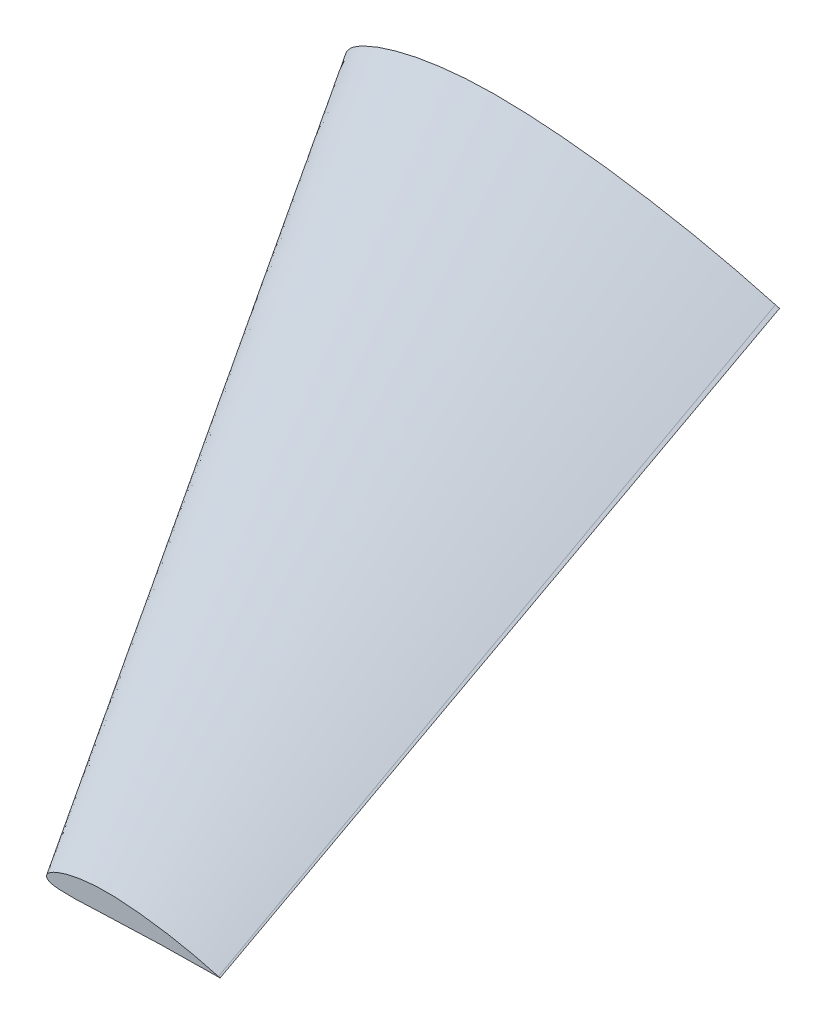
ISO-10303-21;
HEADER;
FILE_DESCRIPTION(('STEP AP214'),'2;1');
FILE_NAME('part.step','',(''),(''),'','','');
FILE_SCHEMA(('AUTOMOTIVE_DESIGN { 1 0 10303 214 1 1 1 1 }'));
ENDSEC;
DATA;
#1=APPLICATION_CONTEXT('core data for automotive mechanical design processes');
#2=APPLICATION_PROTOCOL_DEFINITION('international standard','automotive_design',2000,#1);
#3=PRODUCT_CONTEXT('',#1,'mechanical');
#4=PRODUCT('Part','Part','',(#3));
#5=PRODUCT_RELATED_PRODUCT_CATEGORY('part','',(#4));
#6=PRODUCT_DEFINITION_FORMATION('','',#4);
#7=PRODUCT_DEFINITION_CONTEXT('part definition',#1,'design');
#8=PRODUCT_DEFINITION('design','',#6,#7);
#9=PRODUCT_DEFINITION_SHAPE('','',#8);
#10=(LENGTH_UNIT() NAMED_UNIT(*) SI_UNIT(.MILLI.,.METRE.));
#11=(NAMED_UNIT(*) PLANE_ANGLE_UNIT() SI_UNIT($,.RADIAN.));
#12=(NAMED_UNIT(*) SI_UNIT($,.STERADIAN.) SOLID_ANGLE_UNIT());
#13=UNCERTAINTY_MEASURE_WITH_UNIT(LENGTH_MEASURE(1.E-05),#10,'distance_accuracy_value','');
#14=(GEOMETRIC_REPRESENTATION_CONTEXT(3) GLOBAL_UNCERTAINTY_ASSIGNED_CONTEXT((#13)) GLOBAL_UNIT_ASSIGNED_CONTEXT((#10,
#11,#12)) REPRESENTATION_CONTEXT('',''));
#15=CARTESIAN_POINT('',(0.,0.,0.));
#16=DIRECTION('',(0.,0.,1.));
#17=DIRECTION('',(1.,0.,0.));
#18=AXIS2_PLACEMENT_3D('',#15,#16,#17);
#19=CARTESIAN_POINT('',(2611.90558840419,14.137035774235,4000.));
#20=DIRECTION('',(0.,0.,-1.));
#21=DIRECTION('',(-1.,0.,0.));
#22=AXIS2_PLACEMENT_3D('',#19,#20,#21);
#23=PLANE('',#22);
#24=DIRECTION('',(1.,0.,0.));
#25=VECTOR('',#24,1.);
#26=CARTESIAN_POINT('',(3416.90613838149,-1.04000000000004,4000.));
#27=LINE('',#26,#25);
#28=CARTESIAN_POINT('',(3409.39155389652,-1.04000000000004,4000.));
#29=VERTEX_POINT('',#28);
#30=CARTESIAN_POINT('',(3416.90613838149,-1.04000000000004,4000.));
#31=VERTEX_POINT('',#30);
#32=EDGE_CURVE('E205',#29,#31,#27,.T.);
#33=ORIENTED_EDGE('',*,*,#32,.T.);
#34=DIRECTION('',(-0.963674675854864,0.26707886310231,0.));
#35=VECTOR('',#34,1.);
#36=CARTESIAN_POINT('',(3409.40107675851,1.04000000000004,4000.));
#37=LINE('',#36,#35);
#38=CARTESIAN_POINT('',(3409.40107675851,1.04000000000004,4000.));
#39=VERTEX_POINT('',#38);
#40=EDGE_CURVE('E12',#31,#39,#37,.T.);
#41=ORIENTED_EDGE('',*,*,#40,.T.);
#42=CARTESIAN_POINT('',(3409.40107675851,1.04000000000004,4000.));
#43=CARTESIAN_POINT('',(3396.09809076598,4.72687324028573,4000.));
#44=CARTESIAN_POINT('',(3369.55631723174,12.082827358261,4000.));
#45=CARTESIAN_POINT('',(3316.37932304548,25.4802802744149,4000.));
#46=CARTESIAN_POINT('',(3249.87088739292,40.3183378539626,4000.));
#47=CARTESIAN_POINT('',(3169.85943987782,55.0112696399438,4000.));
#48=CARTESIAN_POINT('',(3089.89824322459,67.1207186397635,4000.));
#49=CARTESIAN_POINT('',(3009.87704892576,75.8636138772025,4000.));
#50=CARTESIAN_POINT('',(2929.8483990242,81.4543724234697,4000.));
#51=CARTESIAN_POINT('',(2863.01979551546,81.8131703069391,4000.));
#52=CARTESIAN_POINT('',(2809.64384178713,78.3659072765574,4000.));
#53=CARTESIAN_POINT('',(2769.54822136818,73.6869303133855,4000.));
#54=CARTESIAN_POINT('',(2729.35542368063,66.7000994131533,4000.));
#55=CARTESIAN_POINT('',(2696.0367912908,58.2286831730009,4000.));
#56=CARTESIAN_POINT('',(2669.32858071973,49.6411220993702,4000.));
#57=CARTESIAN_POINT('',(2649.18239529108,41.510866551704,4000.));
#58=CARTESIAN_POINT('',(2631.98398103148,32.6971993656611,4000.));
#59=CARTESIAN_POINT('',(2617.0423829142,22.1287199652057,4000.));
#60=CARTESIAN_POINT('',(2603.99969502495,5.08095388242841,4000.));
#61=CARTESIAN_POINT('',(2617.93312386385,-8.0662859863082,4000.));
#62=CARTESIAN_POINT('',(2632.18841863635,-13.2672910477161,4000.));
#63=CARTESIAN_POINT('',(2649.17762616931,-16.8114711385066,4000.));
#64=CARTESIAN_POINT('',(2669.25251175791,-18.6657939715807,4000.));
#65=CARTESIAN_POINT('',(2695.94521450319,-20.0352962374385,4000.));
#66=CARTESIAN_POINT('',(2729.2984118994,-20.0945738990348,4000.));
#67=CARTESIAN_POINT('',(2769.31255015358,-19.1581613081001,4000.));
#68=CARTESIAN_POINT('',(2809.30309237734,-17.2094387394286,4000.));
#69=CARTESIAN_POINT('',(2862.64805480233,-14.9592450826349,4000.));
#70=CARTESIAN_POINT('',(2929.31825290459,-12.0634647220764,4000.));
#71=CARTESIAN_POINT('',(3009.34709204238,-9.42408124276955,4000.));
#72=CARTESIAN_POINT('',(3089.35174610242,-6.45270464009393,4000.));
#73=CARTESIAN_POINT('',(3169.36178854237,-3.97618249899534,4000.));
#74=CARTESIAN_POINT('',(3249.37479809234,-2.25142465848248,4000.));
#75=CARTESIAN_POINT('',(3316.0521791303,-1.49499150595738,4000.));
#76=CARTESIAN_POINT('',(3369.38949948713,-1.04000000000005,4000.));
#77=CARTESIAN_POINT('',(3396.05777575294,-1.04000000000004,4000.));
#78=CARTESIAN_POINT('',(3409.39155389652,-1.04000000000004,4000.));
#79=B_SPLINE_CURVE_WITH_KNOTS('',3,(#42,#43,#44,#45,#46,#47,#48,#49,#50,#51,#52,#53,#54,#55,#56,
#57,#58,#59,#60,#61,#62,#63,#64,#65,#66,#67,#68,#69,#70,#71,#72,#73,#74,#75,#76,#77,#78),
.UNSPECIFIED.,.F.,.F.,(4,1,1,1,1,1,1,1,1,1,1,1,1,1,1,1,1,1,1,1,1,1,1,1,1,1,1,1,1,1,1,1,1,1,4),
(0.,0.0253048857109568,0.0504876533905407,0.100520432651506,0.150190715723339,0.199586606894546,
0.248740009224029,0.297715538989186,0.346600594361287,0.371102737044854,0.395726297170324,
0.420570145356384,0.445825119255769,0.458702215791061,0.471919981785349,0.485786002851729,
0.493461050828321,0.506863029175844,0.516147770049506,0.522766002591757,0.535269014058866,
0.54755113395783,0.559786370715185,0.584228898401235,0.608680810066395,0.633151283581104,
0.657621757095813,0.706558114036031,0.755481870433228,0.804405626830425,0.853320223819576,
0.902221408341012,0.951113135961066,0.975557227893806,1.),.UNSPECIFIED.);
#80=EDGE_CURVE('E100',#39,#29,#79,.T.);
#81=ORIENTED_EDGE('',*,*,#80,.T.);
#82=EDGE_LOOP('',(#33,#41,#81));
#83=FACE_BOUND('',#82,.T.);
#84=ADVANCED_FACE('F89',(#83),#23,.F.);
#85=CARTESIAN_POINT('',(6.15316641724967,26.2141623999582,0.));
#86=DIRECTION('',(0.,0.,-1.));
#87=DIRECTION('',(-1.,0.,0.));
#88=AXIS2_PLACEMENT_3D('',#85,#86,#87);
#89=PLANE('',#88);
#90=CARTESIAN_POINT('',(2000.,2.6,0.));
#91=CARTESIAN_POINT('',(1966.70103397188,11.6647304766563,0.));
#92=CARTESIAN_POINT('',(1900.26379832124,29.7504462396772,0.));
#93=CARTESIAN_POINT('',(1767.17075873069,62.6347387952391,0.));
#94=CARTESIAN_POINT('',(1600.73332560293,98.9678824045066,0.));
#95=CARTESIAN_POINT('',(1400.54073142795,134.783670308584,0.));
#96=CARTESIAN_POINT('',(1200.50333104653,164.141461770852,0.));
#97=CARTESIAN_POINT('',(1000.35447161201,185.082358534294,0.));
#98=CARTESIAN_POINT('',(800.223051366031,198.142993411626,0.));
#99=CARTESIAN_POINT('',(633.150937853031,198.275082024102,0.));
#100=CARTESIAN_POINT('',(499.753306158745,189.04619019959,0.));
#101=CARTESIAN_POINT('',(399.569909427007,176.890078243005,0.));
#102=CARTESIAN_POINT('',(299.169989175932,158.963340134349,0.));
#103=CARTESIAN_POINT('',(215.972113789229,137.403894781309,0.));
#104=CARTESIAN_POINT('',(149.301275893577,115.629753064381,0.));
#105=CARTESIAN_POINT('',(99.0299229036791,95.0739569082964,0.));
#106=CARTESIAN_POINT('',(56.1356653635168,72.8434062052537,0.));
#107=CARTESIAN_POINT('',(18.9034146365154,46.2517473265128,0.));
#108=CARTESIAN_POINT('',(-13.5075012996177,3.48394525439187,0.));
#109=CARTESIAN_POINT('',(21.4758175075462,-29.223990322688,0.));
#110=CARTESIAN_POINT('',(57.1728355910972,-42.0630713527365,0.));
#111=CARTESIAN_POINT('',(99.6855291132229,-50.7288857559532,0.));
#112=CARTESIAN_POINT('',(149.892914807757,-55.1348284131256,0.));
#113=CARTESIAN_POINT('',(216.638947596493,-58.253000780213,0.));
#114=CARTESIAN_POINT('',(300.020871810501,-58.0194475509757,0.));
#115=CARTESIAN_POINT('',(400.043402949313,-55.2204830157727,0.));
#116=CARTESIAN_POINT('',(499.995358846913,-49.8910666507864,0.));
#117=CARTESIAN_POINT('',(633.329214973518,-43.6551402438646,0.));
#118=CARTESIAN_POINT('',(799.968072970636,-35.6527668195814,0.));
#119=CARTESIAN_POINT('',(1000.00576814348,-28.1384757343902,0.));
#120=CARTESIAN_POINT('',(1199.97920205944,-19.7944960480277,0.));
#121=CARTESIAN_POINT('',(1399.97177050333,-12.687564912017,0.));
#122=CARTESIAN_POINT('',(1599.98036089091,-7.45997117422131,0.));
#123=CARTESIAN_POINT('',(1766.66166176578,-4.80577145383526,0.));
#124=CARTESIAN_POINT('',(1899.99696012245,-3.05784382104379,0.));
#125=CARTESIAN_POINT('',(1966.66625334379,-2.75261186017416,0.));
#126=CARTESIAN_POINT('',(2000.,-2.6,0.));
#127=B_SPLINE_CURVE_WITH_KNOTS('',3,(#90,#91,#92,#93,#94,#95,#96,#97,#98,#99,#100,#101,#102,
#103,#104,#105,#106,#107,#108,#109,#110,#111,#112,#113,#114,#115,#116,#117,#118,#119,#120,#121,
#122,#123,#124,#125,#126),.UNSPECIFIED.,.F.,.F.,(4,1,1,1,1,1,1,1,1,1,1,1,1,1,1,1,1,1,1,1,1,1,1,
1,1,1,1,1,1,1,1,1,1,1,4),(0.,0.0253048857109568,0.0504876533905406,0.100520432651506,
0.150190715723339,0.199586606894546,0.248740009224029,0.297715538989186,0.346600594361287,
0.371102737044854,0.395726297170324,0.420570145356384,0.445825119255769,0.458702215791061,
0.471919981785349,0.485786002851729,0.493461050828321,0.506863029175844,0.516147770049506,
0.522766002591757,0.535269014058866,0.54755113395783,0.559786370715185,0.584228898401235,
0.608680810066395,0.633151283581104,0.657621757095813,0.706558114036031,0.755481870433228,
0.804405626830425,0.853320223819576,0.902221408341012,0.951113135961066,0.975557227893806,1.),.UNSPECIFIED.);
#128=CARTESIAN_POINT('',(2000.,2.6,0.));
#129=VERTEX_POINT('',#128);
#130=CARTESIAN_POINT('',(2000.00002510715,-2.60629578909658,0.));
#131=VERTEX_POINT('',#130);
#132=EDGE_CURVE('E132',#129,#131,#127,.T.);
#133=ORIENTED_EDGE('',*,*,#132,.F.);
#134=DIRECTION('',(-0.964887330393448,0.262664119449547,0.));
#135=VECTOR('',#134,1.);
#136=CARTESIAN_POINT('',(2000.,2.6,0.));
#137=LINE('',#136,#135);
#138=CARTESIAN_POINT('',(2019.10201564097,-2.6,0.));
#139=VERTEX_POINT('',#138);
#140=EDGE_CURVE('E137',#139,#129,#137,.T.);
#141=ORIENTED_EDGE('',*,*,#140,.F.);
#142=DIRECTION('',(1.,0.,0.));
#143=VECTOR('',#142,1.);
#144=CARTESIAN_POINT('',(2019.10201564097,-2.6,0.));
#145=LINE('',#144,#143);
#146=EDGE_CURVE('E144',#131,#139,#145,.T.);
#147=ORIENTED_EDGE('',*,*,#146,.F.);
#148=EDGE_LOOP('',(#133,#141,#147));
#149=FACE_BOUND('',#148,.T.);
#150=ADVANCED_FACE('F148',(#149),#89,.T.);
#151=CARTESIAN_POINT('',(2000.,2.6,0.));
#152=CARTESIAN_POINT('',(3409.40107675851,1.04000000000004,4000.));
#153=CARTESIAN_POINT('',(1989.71009408142,5.40114474735776,0.));
#154=CARTESIAN_POINT('',(3405.29055967862,2.1792145668732,4000.));
#155=CARTESIAN_POINT('',(1969.130395662,11.0037997384567,0.));
#156=CARTESIAN_POINT('',(3397.06955452931,4.4577759203332,4000.));
#157=CARTESIAN_POINT('',(1938.24159513592,19.3365711379627,0.));
#158=CARTESIAN_POINT('',(3384.73017537306,7.84719740816268,4000.));
#159=CARTESIAN_POINT('',(1907.31625698435,27.532978270238,0.));
#160=CARTESIAN_POINT('',(3372.3759230518,11.1823047278771,4000.));
#161=CARTESIAN_POINT('',(1876.33434537682,35.5129023418536,0.));
#162=CARTESIAN_POINT('',(3359.99851698939,14.430564392916,4000.));
#163=CARTESIAN_POINT('',(1845.29716942868,43.2747507734364,0.));
#164=CARTESIAN_POINT('',(3347.59874260507,17.5924708486766,4000.00000000001));
#165=CARTESIAN_POINT('',(1814.2112973207,50.8388598811053,0.));
#166=CARTESIAN_POINT('',(3335.17878427932,20.6740900840711,4000.));
#167=CARTESIAN_POINT('',(1783.08145768621,58.2195844615524,0.));
#168=CARTESIAN_POINT('',(3322.74125936802,23.6841386815482,4000.));
#169=CARTESIAN_POINT('',(1741.52031891541,67.826807468846,0.));
#170=CARTESIAN_POINT('',(3306.13509104511,27.6022467589521,4000.00000000001));
#171=CARTESIAN_POINT('',(1689.46637549961,79.3856410791386,0.));
#172=CARTESIAN_POINT('',(3285.33579045103,32.3214707533791,4000.));
#173=CARTESIAN_POINT('',(1626.84517135437,92.531382515517,0.));
#174=CARTESIAN_POINT('',(3260.31235630521,37.6940583613445,4000.00000000001));
#175=CARTESIAN_POINT('',(1564.07201370696,104.930036378815,0.));
#176=CARTESIAN_POINT('',(3235.22673279857,42.7685673209072,3999.99999999999));
#177=CARTESIAN_POINT('',(1501.15999142198,116.602411923288,0.));
#178=CARTESIAN_POINT('',(3210.08402939627,47.5525951686458,4000.00000000001));
#179=CARTESIAN_POINT('',(1438.1245169601,127.586426500972,0.));
#180=CARTESIAN_POINT('',(3184.89057783273,52.06164140879,3999.99999999999));
#181=CARTESIAN_POINT('',(1374.98104077545,137.930277778158,0.));
#182=CARTESIAN_POINT('',(3159.65261403787,56.3148234243463,4000.));
#183=CARTESIAN_POINT('',(1311.73590226923,147.632530042599,0.));
#184=CARTESIAN_POINT('',(3134.37270640903,60.3116944712175,4000.));
#185=CARTESIAN_POINT('',(1248.38441516226,156.61522659285,0.));
#186=CARTESIAN_POINT('',(3109.0488006804,64.0208536447916,4000.));
#187=CARTESIAN_POINT('',(1184.92637375113,164.811339573248,0.));
#188=CARTESIAN_POINT('',(3083.68073194109,67.4156683126025,4000.));
#189=CARTESIAN_POINT('',(1121.365572007,172.167962165571,0.));
#190=CARTESIAN_POINT('',(3058.26990598,70.4748798300837,4000.));
#191=CARTESIAN_POINT('',(1057.71572383979,178.70685537604,0.));
#192=CARTESIAN_POINT('',(3032.82185659531,73.2071352573766,4000.00000000001));
#193=CARTESIAN_POINT('',(993.988503599153,184.441056584322,0.));
#194=CARTESIAN_POINT('',(3007.34129490756,75.6177527571647,4000.));
#195=CARTESIAN_POINT('',(930.194141343806,189.373689641945,0.));
#196=CARTESIAN_POINT('',(2981.83229203792,77.7076842493589,4000.));
#197=CARTESIAN_POINT('',(866.330866239386,193.326885374077,0.));
#198=CARTESIAN_POINT('',(2956.29388096354,79.4062914142434,4000.));
#199=CARTESIAN_POINT('',(802.406686815807,196.138491489312,0.));
#200=CARTESIAN_POINT('',(2930.72889931266,80.6480851050417,4000.));
#201=CARTESIAN_POINT('',(749.0989173132,197.389487066114,0.));
#202=CARTESIAN_POINT('',(2909.40766328822,81.2464669704787,4000.));
#203=CARTESIAN_POINT('',(706.443508297489,197.64293050651,0.));
#204=CARTESIAN_POINT('',(2892.34555648073,81.4259859682073,4000.));
#205=CARTESIAN_POINT('',(674.452091881232,197.435209155699,0.));
#206=CARTESIAN_POINT('',(2879.54833871674,81.401640468947,3999.99999999999));
#207=CARTESIAN_POINT('',(642.466083278242,196.806392255469,0.));
#208=CARTESIAN_POINT('',(2866.75240463001,81.2089187218839,4000.));
#209=CARTESIAN_POINT('',(610.491864111822,195.732941040377,0.));
#210=CARTESIAN_POINT('',(2853.96045705088,80.8381609731132,4000.00000000001));
#211=CARTESIAN_POINT('',(578.53674677965,194.190634194959,0.));
#212=CARTESIAN_POINT('',(2841.17519880973,80.2797074687301,4000.));
#213=CARTESIAN_POINT('',(546.608836155188,192.1612877389,0.));
#214=CARTESIAN_POINT('',(2828.39995679744,79.5268588228126,4000.));
#215=CARTESIAN_POINT('',(514.716657917447,189.630893526163,0.));
#216=CARTESIAN_POINT('',(2815.63805790488,78.572915649439,4000.00000000001));
#217=CARTESIAN_POINT('',(482.869775151739,186.582675315854,0.));
#218=CARTESIAN_POINT('',(2802.89332346851,77.4122178436336,3999.99999999999));
#219=CARTESIAN_POINT('',(451.077970850943,183.004806787774,0.));
#220=CARTESIAN_POINT('',(2790.16962910326,76.0392938961784,4000.00000000001));
#221=CARTESIAN_POINT('',(419.351977132354,178.883943929643,0.));
#222=CARTESIAN_POINT('',(2777.47126689329,74.4491165762423,3999.99999999999));
#223=CARTESIAN_POINT('',(387.702122932324,174.213706754102,0.));
#224=CARTESIAN_POINT('',(2764.80232922388,72.6390374700623,4000.00000000001));
#225=CARTESIAN_POINT('',(356.142802601976,168.96519112266,0.));
#226=CARTESIAN_POINT('',(2752.16855211639,70.5974350907067,4000.));
#227=CARTESIAN_POINT('',(329.938237332332,164.053078891584,0.));
#228=CARTESIAN_POINT('',(2741.67731975435,68.6807732732983,4000.));
#229=CARTESIAN_POINT('',(309.044279088125,159.77275315683,0.));
#230=CARTESIAN_POINT('',(2733.31163213847,67.0066532441661,4000.));
#231=CARTESIAN_POINT('',(293.412665381303,156.378281069049,0.));
#232=CARTESIAN_POINT('',(2727.05248490245,65.6778341375434,4000.));
#233=CARTESIAN_POINT('',(277.823145199001,152.795432923787,0.));
#234=CARTESIAN_POINT('',(2720.80992548134,64.2729521489759,4000.));
#235=CARTESIAN_POINT('',(262.27834698231,149.023278995205,0.));
#236=CARTESIAN_POINT('',(2714.58483126155,62.7927503362418,4000.));
#237=CARTESIAN_POINT('',(246.781010137538,145.060599690389,0.));
#238=CARTESIAN_POINT('',(2708.37841653001,61.2359493756053,4000.));
#239=CARTESIAN_POINT('',(231.333988818275,140.906146636547,0.));
#240=CARTESIAN_POINT('',(2702.19175415262,59.6024973599604,4000.00000000001));
#241=CARTESIAN_POINT('',(215.940026053078,136.559110008628,0.));
#242=CARTESIAN_POINT('',(2696.02596831789,57.8918381401252,4000.));
#243=CARTESIAN_POINT('',(200.602262649966,132.017891541353,0.));
#244=CARTESIAN_POINT('',(2689.88231223921,56.1034116662094,4000.00000000001));
#245=CARTESIAN_POINT('',(185.323126714379,127.282879386277,0.));
#246=CARTESIAN_POINT('',(2683.76173226946,54.2373897007526,3999.99999999999));
#247=CARTESIAN_POINT('',(170.118082045258,122.314558599156,0.));
#248=CARTESIAN_POINT('',(2677.67039315855,52.2778411190536,4000.));
#249=CARTESIAN_POINT('',(155.004621638709,117.073571751826,0.));
#250=CARTESIAN_POINT('',(2671.61514190634,50.2091567064085,4000.));
#251=CARTESIAN_POINT('',(140.00395238788,111.517401279718,0.));
#252=CARTESIAN_POINT('',(2665.60450643467,48.0140065885663,4000.00000000001));
#253=CARTESIAN_POINT('',(125.134148254373,105.619550528496,0.));
#254=CARTESIAN_POINT('',(2659.64543533836,45.682307430961,4000.));
#255=CARTESIAN_POINT('',(112.864421056757,100.407909568933,0.));
#256=CARTESIAN_POINT('',(2654.727963667,43.6196936263155,4000.));
#257=CARTESIAN_POINT('',(103.130022268966,96.0533704367666,0.));
#258=CARTESIAN_POINT('',(2650.82585906098,41.8961519049384,4000.));
#259=CARTESIAN_POINT('',(95.8714035255339,92.6948145053056,0.));
#260=CARTESIAN_POINT('',(2647.91631655449,40.5656035309354,4000.));
#261=CARTESIAN_POINT('',(88.6591027843448,89.2377530223398,0.));
#262=CARTESIAN_POINT('',(2645.02490957853,39.1959963298226,4000.));
#263=CARTESIAN_POINT('',(81.5005075099442,85.6707869242071,0.));
#264=CARTESIAN_POINT('',(2642.15471191659,37.7825847900732,4000.));
#265=CARTESIAN_POINT('',(74.4025998211862,81.9842928423578,0.));
#266=CARTESIAN_POINT('',(2639.30879735216,36.3206234001604,4000.00000000001));
#267=CARTESIAN_POINT('',(67.3751742989001,78.1651842046877,0.));
#268=CARTESIAN_POINT('',(2636.49064404279,34.8060115453851,3999.99999999999));
#269=CARTESIAN_POINT('',(60.4268201194817,74.2036173100786,0.));
#270=CARTESIAN_POINT('',(2633.70393288357,33.2340097775525,4000.00000000001));
#271=CARTESIAN_POINT('',(53.5727117368614,70.081227551703,0.));
#272=CARTESIAN_POINT('',(2630.95466520784,31.5975174280108,3999.99999999998));
#273=CARTESIAN_POINT('',(46.8205764435895,65.7933563961936,0.));
#274=CARTESIAN_POINT('',(2628.24577324402,29.8947824128774,4000.00000000001));
#275=CARTESIAN_POINT('',(40.2106754287529,61.2881022312396,0.));
#276=CARTESIAN_POINT('',(2625.59347408747,28.1047088252058,3999.99999999999));
#277=CARTESIAN_POINT('',(33.81321387122,56.4839011815307,0.));
#278=CARTESIAN_POINT('',(2623.02556521088,26.19468012932,4000.00000000001));
#279=CARTESIAN_POINT('',(27.6817761417211,51.3439720238466,0.));
#280=CARTESIAN_POINT('',(2620.56348136187,24.149903666225,3999.99999999999));
#281=CARTESIAN_POINT('',(21.847911707783,45.8683985180614,0.));
#282=CARTESIAN_POINT('',(2618.21975849854,21.970241919124,4000.00000000001));
#283=CARTESIAN_POINT('',(16.3397952514235,40.0644319606948,0.));
#284=CARTESIAN_POINT('',(2616.00585545864,19.6587430629931,3999.99999999999));
#285=CARTESIAN_POINT('',(11.2359540980454,33.8998579036326,0.));
#286=CARTESIAN_POINT('',(2613.95273853612,17.2020824589194,4000.00000000001));
#287=CARTESIAN_POINT('',(7.42219596155225,28.4249013974583,0.));
#288=CARTESIAN_POINT('',(2612.41745573984,15.0190921307719,4000.));
#289=CARTESIAN_POINT('',(4.7419652704605,23.8121974165453,0.));
#290=CARTESIAN_POINT('',(2611.3364531109,13.1787398980747,4000.));
#291=CARTESIAN_POINT('',(2.95949367342032,20.2301820283516,0.));
#292=CARTESIAN_POINT('',(2610.61736541433,11.7492638569007,4000.));
#293=CARTESIAN_POINT('',(1.45410918227578,16.5213926250228,0.));
#294=CARTESIAN_POINT('',(2610.00799446398,10.2683440675143,4000.));
#295=CARTESIAN_POINT('',(0.293708367254342,12.6896602206487,0.));
#296=CARTESIAN_POINT('',(2609.53707553424,8.73776970023416,4000.));
#297=CARTESIAN_POINT('',(-0.441395009006659,8.75121085298718,0.));
#298=CARTESIAN_POINT('',(2609.23568627534,7.16362165328058,4000.));
#299=CARTESIAN_POINT('',(-0.65554287819903,4.74860626516798,0.));
#300=CARTESIAN_POINT('',(2609.14283414075,5.56291687945029,3999.99999999999));
#301=CARTESIAN_POINT('',(-0.265777637087465,0.754888973574428,0.));
#302=CARTESIAN_POINT('',(2609.2914249698,3.96462638100546,4000.00000000002));
#303=CARTESIAN_POINT('',(0.787194663086476,-3.11663117799773,0.));
#304=CARTESIAN_POINT('',(2609.7056972633,2.41404314608018,3999.99999999999));
#305=CARTESIAN_POINT('',(2.39760779182842,-6.78662344440726,0.));
#306=CARTESIAN_POINT('',(2610.34314438829,0.94306478008715,4000.00000000001));
#307=CARTESIAN_POINT('',(4.43814745090308,-10.2326906631778,0.));
#308=CARTESIAN_POINT('',(2611.15330790541,-0.439139322741957,3999.99999999999));
#309=CARTESIAN_POINT('',(6.81512857423191,-13.4538029006519,0.));
#310=CARTESIAN_POINT('',(2612.09800618053,-1.73192729890438,4000.));
#311=CARTESIAN_POINT('',(9.45373903755943,-16.4625755045686,0.));
#312=CARTESIAN_POINT('',(2613.14848493858,-2.94028738216621,4000.));
#313=CARTESIAN_POINT('',(12.3024620121791,-19.2722380349337,0.));
#314=CARTESIAN_POINT('',(2614.28227883092,-4.06947570349377,4000.));
#315=CARTESIAN_POINT('',(15.3219217510446,-21.8968375543721,0.));
#316=CARTESIAN_POINT('',(2615.48605706784,-5.12445143064801,4000.));
#317=CARTESIAN_POINT('',(18.4856197774947,-24.3450214457587,0.));
#318=CARTESIAN_POINT('',(2616.74648885967,-6.1101737313899,4000.));
#319=CARTESIAN_POINT('',(22.8676227445535,-27.3857865407935,0.));
#320=CARTESIAN_POINT('',(2618.49430066838,-7.33382275053691,4000.));
#321=CARTESIAN_POINT('',(28.6216932165647,-30.7650928482394,0.));
#322=CARTESIAN_POINT('',(2620.78956686555,-8.69658990859335,4000.));
#323=CARTESIAN_POINT('',(35.8785885100161,-34.1459105095642,0.));
#324=CARTESIAN_POINT('',(2623.68649590111,-10.061816237342,4000.));
#325=CARTESIAN_POINT('',(43.3745947515943,-36.9465534008141,0.));
#326=CARTESIAN_POINT('',(2626.67981382433,-11.1959585304763,4000.00000000001));
#327=CARTESIAN_POINT('',(51.0067503641325,-39.3421987552524,0.));
#328=CARTESIAN_POINT('',(2629.72848847646,-12.1680514779303,4000.));
#329=CARTESIAN_POINT('',(58.702829249484,-41.520158132666,0.));
#330=CARTESIAN_POINT('',(2632.80302478412,-13.053415525438,3999.99999999999));
#331=CARTESIAN_POINT('',(66.4572726621451,-43.4817935282696,0.));
#332=CARTESIAN_POINT('',(2635.9013695992,-13.8521668392557,4000.00000000001));
#333=CARTESIAN_POINT('',(74.2578267491896,-45.2491116828626,0.));
#334=CARTESIAN_POINT('',(2639.01846490111,-14.5734791030369,3999.99999999999));
#335=CARTESIAN_POINT('',(82.0977554588721,-46.8335104525651,0.));
#336=CARTESIAN_POINT('',(2642.1516873376,-15.2214161727968,4000.));
#337=CARTESIAN_POINT('',(89.969546654592,-48.2494875951944,0.));
#338=CARTESIAN_POINT('',(2645.29791910976,-15.8023776696422,4000.));
#339=CARTESIAN_POINT('',(100.500674170751,-49.9300649353368,0.));
#340=CARTESIAN_POINT('',(2649.50747873655,-16.4937206424536,4000.));
#341=CARTESIAN_POINT('',(113.718418551683,-51.6677717997109,0.));
#342=CARTESIAN_POINT('',(2654.7915946705,-17.2130669545695,4000.));
#343=CARTESIAN_POINT('',(129.633833121875,-53.2816876328632,0.));
#344=CARTESIAN_POINT('',(2661.15505776806,-17.8876695155539,4000.00000000001));
#345=CARTESIAN_POINT('',(145.581030286811,-54.533530214148,0.));
#346=CARTESIAN_POINT('',(2667.53187736474,-18.4177154379731,4000.));
#347=CARTESIAN_POINT('',(161.54442623551,-55.5533162777864,0.));
#348=CARTESIAN_POINT('',(2673.91561894934,-18.8546763091425,4000.));
#349=CARTESIAN_POINT('',(177.518944343608,-56.3802480699429,0.));
#350=CARTESIAN_POINT('',(2680.30414737551,-19.2147430519837,4000.00000000001));
#351=CARTESIAN_POINT('',(193.502110343088,-57.0184193389914,0.));
#352=CARTESIAN_POINT('',(2686.69648403148,-19.4992656646649,3999.99999999999));
#353=CARTESIAN_POINT('',(209.491165932629,-57.4841427563717,0.));
#354=CARTESIAN_POINT('',(2693.09148870274,-19.7147528226015,4000.00000000002));
#355=CARTESIAN_POINT('',(225.48406438314,-57.7899057411213,0.));
#356=CARTESIAN_POINT('',(2699.48832152785,-19.8663933424705,3999.99999999999));
#357=CARTESIAN_POINT('',(241.478989585666,-57.9541287956346,0.));
#358=CARTESIAN_POINT('',(2705.88622558266,-19.9611731689226,4000.00000000001));
#359=CARTESIAN_POINT('',(257.474691689279,-57.9924615203724,0.));
#360=CARTESIAN_POINT('',(2712.28466060354,-20.0060859818653,4000.));
#361=CARTESIAN_POINT('',(273.470254048621,-57.9223733877262,0.));
#362=CARTESIAN_POINT('',(2718.68325106451,-20.0068029684623,4000.));
#363=CARTESIAN_POINT('',(289.465124021935,-57.7596759550026,0.));
#364=CARTESIAN_POINT('',(2725.08171118408,-19.971567228292,4000.));
#365=CARTESIAN_POINT('',(305.459047476014,-57.5226998434763,0.));
#366=CARTESIAN_POINT('',(2731.47994633915,-19.9057987766473,4000.));
#367=CARTESIAN_POINT('',(321.451911373759,-57.2228527454899,0.));
#368=CARTESIAN_POINT('',(2737.87786190661,-19.8149176288213,4000.));
#369=CARTESIAN_POINT('',(342.773943591169,-56.7362993344455,0.));
#370=CARTESIAN_POINT('',(2746.40785494011,-19.6596668956162,4000.));
#371=CARTESIAN_POINT('',(369.422482856541,-55.9675636869225,0.));
#372=CARTESIAN_POINT('',(2757.06904123936,-19.4006007091745,4000.));
#373=CARTESIAN_POINT('',(401.392262624594,-54.7860007580308,0.));
#374=CARTESIAN_POINT('',(2769.85953785071,-18.9866626545438,4000.));
#375=CARTESIAN_POINT('',(433.351445605452,-53.3480659719103,0.));
#376=CARTESIAN_POINT('',(2782.64625591907,-18.4698318429278,4000.));
#377=CARTESIAN_POINT('',(465.303445398517,-51.7617609528563,0.));
#378=CARTESIAN_POINT('',(2795.43036384423,-17.8938600320032,4000.));
#379=CARTESIAN_POINT('',(497.253026831381,-50.1270831353382,0.));
#380=CARTESIAN_POINT('',(2808.21358153877,-17.2985048313579,4000.));
#381=CARTESIAN_POINT('',(529.205788473999,-48.5555576386186,0.));
#382=CARTESIAN_POINT('',(2820.99794017772,-16.7283348308844,4000.));
#383=CARTESIAN_POINT('',(561.160791237607,-47.0300778980769,0.));
#384=CARTESIAN_POINT('',(2833.78310403293,-16.1767328426142,4000.));
#385=CARTESIAN_POINT('',(593.116800614526,-45.5255904303864,0.));
#386=CARTESIAN_POINT('',(2846.5686116654,-15.6333664031731,4000.));
#387=CARTESIAN_POINT('',(625.072566011057,-44.0155315654367,0.));
#388=CARTESIAN_POINT('',(2859.35402377605,-15.0879272755933,4000.));
#389=CARTESIAN_POINT('',(657.028238844517,-42.5031224244799,0.));
#390=CARTESIAN_POINT('',(2872.1393808688,-14.5413604501079,4000.));
#391=CARTESIAN_POINT('',(688.984398393451,-41.0005979232514,0.));
#392=CARTESIAN_POINT('',(2884.9249093136,-13.9990342799537,4000.));
#393=CARTESIAN_POINT('',(720.941443542657,-39.5165427725466,0.));
#394=CARTESIAN_POINT('',(2897.71072573054,-13.4636552499796,4000.));
#395=CARTESIAN_POINT('',(752.89986605594,-38.0619443537334,0.));
#396=CARTESIAN_POINT('',(2910.49704861733,-12.9408154347857,4000.));
#397=CARTESIAN_POINT('',(784.860014431908,-36.6451608555432,0.));
#398=CARTESIAN_POINT('',(2923.2839313345,-12.4318804794724,4000.));
#399=CARTESIAN_POINT('',(816.822393943252,-35.2790345482888,0.));
#400=CARTESIAN_POINT('',(2936.07165579713,-11.9449363195828,4000.));
#401=CARTESIAN_POINT('',(848.786846877439,-33.9618054595154,0.));
#402=CARTESIAN_POINT('',(2948.86004811777,-11.4760367808918,4000.));
#403=CARTESIAN_POINT('',(880.752715115204,-32.678873811135,0.));
#404=CARTESIAN_POINT('',(2961.64893440899,-11.0212356891744,4000.));
#405=CARTESIAN_POINT('',(912.719551240814,-31.4196557638953,0.));
#406=CARTESIAN_POINT('',(2974.4381490152,-10.5760057777598,3999.99999999999));
#407=CARTESIAN_POINT('',(944.686840318994,-30.1713453865014,0.));
#408=CARTESIAN_POINT('',(2987.22752628082,-10.1358197799776,4000.));
#409=CARTESIAN_POINT('',(976.654153116401,-28.9229094322994,0.));
#410=CARTESIAN_POINT('',(3000.01686673623,-9.69491151466356,4000.00000000001));
#411=CARTESIAN_POINT('',(1008.62096692086,-27.6610165319709,0.));
#412=CARTESIAN_POINT('',(3012.80597091182,-9.2475148006539,4000.));
#413=CARTESIAN_POINT('',(1051.24231758812,-25.9506363306952,0.));
#414=CARTESIAN_POINT('',(3029.85781741698,-8.64312051761396,4000.));
#415=CARTESIAN_POINT('',(1104.51809676528,-23.7883713519697,0.));
#416=CARTESIAN_POINT('',(3051.17211976444,-7.87435379420179,4000.));
#417=CARTESIAN_POINT('',(1168.45008560374,-21.2162803497005,0.));
#418=CARTESIAN_POINT('',(3076.74965819007,-6.96370726362496,4000.));
#419=CARTESIAN_POINT('',(1232.38609478615,-18.7420303202256,0.));
#420=CARTESIAN_POINT('',(3102.32845389089,-6.09041756294336,4000.00000000001));
#421=CARTESIAN_POINT('',(1296.32755252799,-16.4084577589151,0.));
#422=CARTESIAN_POINT('',(3127.90909410005,-5.27450345279214,4000.));
#423=CARTESIAN_POINT('',(1360.27467487714,-14.2309782213576,0.));
#424=CARTESIAN_POINT('',(3153.49157429845,-4.52046405648853,4000.));
#425=CARTESIAN_POINT('',(1424.22787106403,-12.2340925772643,0.));
#426=CARTESIAN_POINT('',(3179.07603528639,-3.83898057712328,4000.));
#427=CARTESIAN_POINT('',(1488.18704283036,-10.4328606681877,0.));
#428=CARTESIAN_POINT('',(3204.66239256955,-3.23558800326502,4000.));
#429=CARTESIAN_POINT('',(1552.15166351446,-8.82963930736135,0.));
#430=CARTESIAN_POINT('',(3230.25042899571,-2.71156363712751,4000.));
#431=CARTESIAN_POINT('',(1616.12132781312,-7.43365448459935,0.));
#432=CARTESIAN_POINT('',(3255.83996162075,-2.27025631198381,4000.));
#433=CARTESIAN_POINT('',(1680.09525724946,-6.24008811518697,0.));
#434=CARTESIAN_POINT('',(3281.43067349489,-1.91020433724205,4000.));
#435=CARTESIAN_POINT('',(1733.40923088036,-5.37355216309749,0.));
#436=CARTESIAN_POINT('',(3302.75685995922,-1.66101560171665,4000.));
#437=CARTESIAN_POINT('',(1776.06140093017,-4.73845256665094,0.));
#438=CARTESIAN_POINT('',(3319.81800268935,-1.48510731340724,4000.));
#439=CARTESIAN_POINT('',(1808.05089274153,-4.2838466967619,0.));
#440=CARTESIAN_POINT('',(3332.61393854759,-1.36263124581693,4000.));
#441=CARTESIAN_POINT('',(1840.04075434819,-3.85186020140846,0.));
#442=CARTESIAN_POINT('',(3345.40993524778,-1.24734412545466,4000.));
#443=CARTESIAN_POINT('',(1872.03127571059,-3.46676146068917,0.));
#444=CARTESIAN_POINT('',(3358.20605384824,-1.15125782637772,4000.));
#445=CARTESIAN_POINT('',(1904.02262168562,-3.15062158906066,0.));
#446=CARTESIAN_POINT('',(3371.0023554073,-1.0863842226434,4000.));
#447=CARTESIAN_POINT('',(1936.01475829868,-2.92111143360756,0.));
#448=CARTESIAN_POINT('',(3383.79875320339,-1.04997434936232,4000.));
#449=CARTESIAN_POINT('',(1968.00727683539,-2.74636821333586,0.));
#450=CARTESIAN_POINT('',(3396.59516051494,-1.03927924164513,4000.));
#451=CARTESIAN_POINT('',(1989.33575169482,-2.64882411773263,0.));
#452=CARTESIAN_POINT('',(3405.1260925506,-1.04000000000004,4000.));
#453=CARTESIAN_POINT('',(2001.5787378952,-2.6,0.));
#454=CARTESIAN_POINT('',(3410.02300720669,-1.04000000000004,4000.));
#455=CARTESIAN_POINT('',(2004.7556175409,-2.6,0.));
#456=CARTESIAN_POINT('',(3411.27796050734,-1.04000000000004,4000.00000000001));
#457=CARTESIAN_POINT('',(2009.55100782048,-2.6,0.));
#458=CARTESIAN_POINT('',(3413.148846139,-1.04000000000004,3999.99999999999));
#459=CARTESIAN_POINT('',(2014.34639810007,-2.6,0.));
#460=CARTESIAN_POINT('',(3415.01973177066,-1.04000000000004,4000.00000000001));
#461=CARTESIAN_POINT('',(2017.52327774576,-2.6,0.));
#462=CARTESIAN_POINT('',(3416.27468507131,-1.04000000000004,4000.));
#463=CARTESIAN_POINT('',(2019.10201564097,-2.6,0.));
#464=CARTESIAN_POINT('',(3416.90613838149,-1.04000000000004,4000.));
#465=B_SPLINE_SURFACE_WITH_KNOTS('',3,1,((#151,#152),(#153,#154),(#155,#156),(#157,#158),(#159,
#160),(#161,#162),(#163,#164),(#165,#166),(#167,#168),(#169,#170),(#171,#172),(#173,#174),(#175,
#176),(#177,#178),(#179,#180),(#181,#182),(#183,#184),(#185,#186),(#187,#188),(#189,#190),(#191,
#192),(#193,#194),(#195,#196),(#197,#198),(#199,#200),(#201,#202),(#203,#204),(#205,#206),(#207,
#208),(#209,#210),(#211,#212),(#213,#214),(#215,#216),(#217,#218),(#219,#220),(#221,#222),(#223,
#224),(#225,#226),(#227,#228),(#229,#230),(#231,#232),(#233,#234),(#235,#236),(#237,#238),(#239,
#240),(#241,#242),(#243,#244),(#245,#246),(#247,#248),(#249,#250),(#251,#252),(#253,#254),(#255,
#256),(#257,#258),(#259,#260),(#261,#262),(#263,#264),(#265,#266),(#267,#268),(#269,#270),(#271,
#272),(#273,#274),(#275,#276),(#277,#278),(#279,#280),(#281,#282),(#283,#284),(#285,#286),(#287,
#288),(#289,#290),(#291,#292),(#293,#294),(#295,#296),(#297,#298),(#299,#300),(#301,#302),(#303,
#304),(#305,#306),(#307,#308),(#309,#310),(#311,#312),(#313,#314),(#315,#316),(#317,#318),(#319,
#320),(#321,#322),(#323,#324),(#325,#326),(#327,#328),(#329,#330),(#331,#332),(#333,#334),(#335,
#336),(#337,#338),(#339,#340),(#341,#342),(#343,#344),(#345,#346),(#347,#348),(#349,#350),(#351,
#352),(#353,#354),(#355,#356),(#357,#358),(#359,#360),(#361,#362),(#363,#364),(#365,#366),(#367,
#368),(#369,#370),(#371,#372),(#373,#374),(#375,#376),(#377,#378),(#379,#380),(#381,#382),(#383,
#384),(#385,#386),(#387,#388),(#389,#390),(#391,#392),(#393,#394),(#395,#396),(#397,#398),(#399,
#400),(#401,#402),(#403,#404),(#405,#406),(#407,#408),(#409,#410),(#411,#412),(#413,#414),(#415,
#416),(#417,#418),(#419,#420),(#421,#422),(#423,#424),(#425,#426),(#427,#428),(#429,#430),(#431,
#432),(#433,#434),(#435,#436),(#437,#438),(#439,#440),(#441,#442),(#443,#444),(#445,#446),(#447,
#448),(#449,#450),(#451,#452),(#453,#454),(#455,#456),(#457,#458),(#459,#460),(#461,#462),(#463,
#464)),.UNSPECIFIED.,.F.,.F.,.F.,(4,1,1,1,1,1,1,1,1,1,1,1,1,1,1,1,1,1,1,1,1,1,1,1,1,1,1,1,1,1,1,
1,1,1,1,1,1,1,1,1,1,1,1,1,1,1,1,1,1,1,1,1,1,1,1,1,1,1,1,1,1,1,1,1,1,1,1,1,1,1,1,1,1,1,1,1,1,1,1,
1,1,1,1,1,1,1,1,1,1,1,1,1,1,1,1,1,1,1,1,1,1,1,1,1,1,1,1,1,1,1,1,1,1,1,1,1,1,1,1,1,1,1,1,1,1,1,1,
1,1,1,1,1,1,1,1,1,1,1,1,1,1,1,1,1,1,1,1,1,1,2,1,1,1,4),(2,2),(0.,0.0077765250238279,
0.0155530500476558,0.0233295750714837,0.0311061000953116,0.0388826251191395,0.0466591501429674,
0.0544356751667953,0.0622122001906232,0.077765250238279,0.0933183002859348,0.108871350333591,
0.124424400381246,0.139977450428902,0.155530500476558,0.171083550524214,0.18663660057187,
0.202189650619525,0.217742700667181,0.233295750714837,0.248848800762493,0.264401850810149,
0.279954900857804,0.29550795090546,0.311061000953116,0.318837525976944,0.326614051000772,
0.3343905760246,0.342167101048428,0.349943626072255,0.357720151096083,0.365496676119911,
0.373273201143739,0.381049726167567,0.388826251191395,0.396602776215223,0.404379301239051,
0.412155826262879,0.416044088774793,0.419932351286707,0.42382061379862,0.427708876310534,
0.431597138822448,0.435485401334362,0.439373663846276,0.44326192635819,0.447150188870104,
0.451038451382018,0.454926713893932,0.458814976405846,0.46270323891776,0.466591501429674,
0.468535632685631,0.470479763941588,0.472423895197545,0.474368026453502,0.476312157709459,
0.478256288965416,0.480200420221373,0.48214455147733,0.484088682733287,0.486032813989244,
0.487976945245201,0.489921076501158,0.491865207757115,0.493809339013072,0.495753470269029,
0.497697601524986,0.498669667152964,0.499641732780943,0.500613798408921,0.5015858640369,
0.502557929664878,0.503529995292857,0.504502060920835,0.505474126548813,0.506446192176792,
0.50741825780477,0.508390323432749,0.509362389060728,0.510334454688706,0.511306520316684,
0.512278585944663,0.513250651572641,0.515194782828598,0.517138914084555,0.519083045340513,
0.521027176596469,0.522971307852426,0.524915439108383,0.52685957036434,0.528803701620297,
0.530747832876254,0.532691964132211,0.536580226644125,0.540468489156039,0.544356751667953,
0.548245014179867,0.552133276691781,0.556021539203695,0.559909801715609,0.563798064227523,
0.567686326739437,0.571574589251351,0.575462851763265,0.579351114275178,0.583239376787093,
0.587127639299006,0.59101590181092,0.598792426834748,0.606568951858576,0.614345476882404,
0.622122001906232,0.62989852693006,0.637675051953888,0.645451576977716,0.653228102001544,
0.661004627025371,0.6687811520492,0.676557677073027,0.684334202096855,0.692110727120683,
0.699887252144511,0.707663777168339,0.715440302192167,0.723216827215995,0.730993352239822,
0.738769877263651,0.746546402287478,0.754322927311306,0.762099452335134,0.77765250238279,
0.793205552430446,0.808758602478102,0.824311652525757,0.839864702573413,0.855417752621069,
0.870970802668725,0.886523852716381,0.902076902764036,0.917629952811692,0.933183002859348,
0.940959527883176,0.948736052907004,0.956512577930832,0.96428910295466,0.972065627978488,
0.979842153002315,0.987618678026143,0.995395203049971,0.996546402287478,0.997697601524986,
0.998848800762493,1.),(0.,1.),.UNSPECIFIED.);
#466=DIRECTION('',(0.329888680961269,0.00036816770957192,0.944019768133153));
#467=VECTOR('',#466,1.);
#468=CARTESIAN_POINT('',(2718.00407701123,-1.82000000000002,2000.));
#469=LINE('',#468,#467);
#470=EDGE_CURVE('E114',#139,#31,#469,.T.);
#471=DIRECTION('',(-0.332324460410153,0.000367834370775533,-0.943165053270622));
#472=VECTOR('',#471,1.);
#473=CARTESIAN_POINT('',(2704.70053837926,1.82000000000002,2000.));
#474=LINE('',#473,#472);
#475=EDGE_CURVE('E128',#39,#129,#474,.T.);
#476=ORIENTED_EDGE('',*,*,#132,.T.);
#477=ORIENTED_EDGE('',*,*,#146,.T.);
#478=ORIENTED_EDGE('',*,*,#470,.T.);
#479=ORIENTED_EDGE('',*,*,#32,.F.);
#480=ORIENTED_EDGE('',*,*,#80,.F.);
#481=ORIENTED_EDGE('',*,*,#475,.T.);
#482=EDGE_LOOP('',(#476,#477,#478,#479,#480,#481));
#483=FACE_BOUND('',#482,.T.);
#484=ADVANCED_FACE('F130',(#483),#465,.T.);
#485=CARTESIAN_POINT('',(2019.10201564097,-2.6,0.));
#486=CARTESIAN_POINT('',(3416.90613838149,-1.04000000000004,4000.));
#487=CARTESIAN_POINT('',(2000.,2.6,0.));
#488=CARTESIAN_POINT('',(3409.40107675851,1.04000000000004,4000.));
#489=B_SPLINE_SURFACE_WITH_KNOTS('',1,1,((#485,#486),(#487,#488)),.UNSPECIFIED.,.F.,.F.,.F.,(2,
2),(2,2),(0.,1.),(0.,1.),.UNSPECIFIED.);
#490=ORIENTED_EDGE('',*,*,#140,.T.);
#491=ORIENTED_EDGE('',*,*,#475,.F.);
#492=ORIENTED_EDGE('',*,*,#40,.F.);
#493=ORIENTED_EDGE('',*,*,#470,.F.);
#494=EDGE_LOOP('',(#490,#491,#492,#493));
#495=FACE_BOUND('',#494,.T.);
#496=ADVANCED_FACE('F140',(#495),#489,.T.);
#497=CLOSED_SHELL('',(#84,#150,#484,#496));
#498=MANIFOLD_SOLID_BREP('B2',#497);
#499=ADVANCED_BREP_SHAPE_REPRESENTATION('',(#18,#498),#14);
#500=SHAPE_DEFINITION_REPRESENTATION(#9,#499);
ENDSEC;
END-ISO-10303-21;
